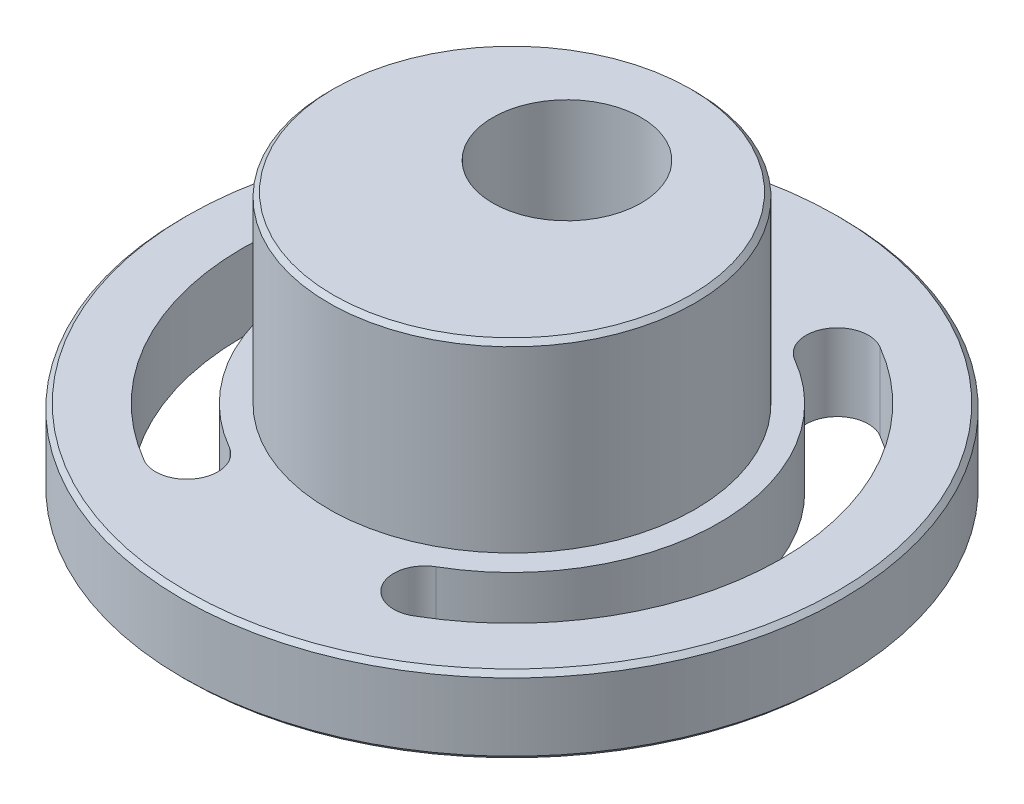
ISO-10303-21;
HEADER;
FILE_DESCRIPTION(('STEP AP214'),'2;1');
FILE_NAME('part.step','',(''),(''),'','','');
FILE_SCHEMA(('AUTOMOTIVE_DESIGN { 1 0 10303 214 1 1 1 1 }'));
ENDSEC;
DATA;
#1=APPLICATION_CONTEXT('core data for automotive mechanical design processes');
#2=APPLICATION_PROTOCOL_DEFINITION('international standard','automotive_design',2000,#1);
#3=PRODUCT_CONTEXT('',#1,'mechanical');
#4=PRODUCT('Part','Part','',(#3));
#5=PRODUCT_RELATED_PRODUCT_CATEGORY('part','',(#4));
#6=PRODUCT_DEFINITION_FORMATION('','',#4);
#7=PRODUCT_DEFINITION_CONTEXT('part definition',#1,'design');
#8=PRODUCT_DEFINITION('design','',#6,#7);
#9=PRODUCT_DEFINITION_SHAPE('','',#8);
#10=(LENGTH_UNIT() NAMED_UNIT(*) SI_UNIT(.MILLI.,.METRE.));
#11=(NAMED_UNIT(*) PLANE_ANGLE_UNIT() SI_UNIT($,.RADIAN.));
#12=(NAMED_UNIT(*) SI_UNIT($,.STERADIAN.) SOLID_ANGLE_UNIT());
#13=UNCERTAINTY_MEASURE_WITH_UNIT(LENGTH_MEASURE(1.E-05),#10,'distance_accuracy_value','');
#14=(GEOMETRIC_REPRESENTATION_CONTEXT(3) GLOBAL_UNCERTAINTY_ASSIGNED_CONTEXT((#13)) GLOBAL_UNIT_ASSIGNED_CONTEXT((#10,
#11,#12)) REPRESENTATION_CONTEXT('',''));
#15=CARTESIAN_POINT('',(0.,0.,0.));
#16=DIRECTION('',(0.,0.,1.));
#17=DIRECTION('',(1.,0.,0.));
#18=AXIS2_PLACEMENT_3D('',#15,#16,#17);
#19=CARTESIAN_POINT('',(240.,-153.95,78.));
#20=DIRECTION('',(0.,1.,0.));
#21=DIRECTION('',(1.,0.,0.));
#22=AXIS2_PLACEMENT_3D('',#19,#20,#21);
#23=CONICAL_SURFACE('',#22,18.,0.785398163397);
#24=CARTESIAN_POINT('',(240.,-154.2,78.));
#25=DIRECTION('',(0.,1.,0.));
#26=DIRECTION('',(1.,0.,0.));
#27=AXIS2_PLACEMENT_3D('',#24,#25,#26);
#28=CIRCLE('',#27,17.75);
#29=CARTESIAN_POINT('',(257.75,-154.2,78.));
#30=VERTEX_POINT('',#29);
#31=EDGE_CURVE('E25',#30,#30,#28,.T.);
#32=ORIENTED_EDGE('',*,*,#31,.T.);
#33=DIRECTION('',(-0.707106781186548,-0.707106781186548,0.));
#34=VECTOR('',#33,1.);
#35=CARTESIAN_POINT('',(258.,-153.95,78.));
#36=LINE('',#35,#34);
#37=CARTESIAN_POINT('',(258.,-153.95,78.));
#38=VERTEX_POINT('',#37);
#39=EDGE_CURVE('E11',#38,#30,#36,.T.);
#40=ORIENTED_EDGE('',*,*,#39,.F.);
#41=CARTESIAN_POINT('',(240.,-153.95,78.));
#42=DIRECTION('',(0.,1.,0.));
#43=DIRECTION('',(1.,0.,0.));
#44=AXIS2_PLACEMENT_3D('',#41,#42,#43);
#45=CIRCLE('',#44,18.);
#46=EDGE_CURVE('E19',#38,#38,#45,.T.);
#47=ORIENTED_EDGE('',*,*,#46,.F.);
#48=ORIENTED_EDGE('',*,*,#39,.T.);
#49=EDGE_LOOP('',(#32,#40,#47,#48));
#50=FACE_BOUND('',#49,.T.);
#51=ADVANCED_FACE('F16',(#50),#23,.T.);
#52=CARTESIAN_POINT('',(240.,-154.2,78.));
#53=DIRECTION('',(0.,-1.,0.));
#54=DIRECTION('',(-1.,0.,0.));
#55=AXIS2_PLACEMENT_3D('',#52,#53,#54);
#56=PLANE('',#55);
#57=CARTESIAN_POINT('',(240.,-154.2,78.));
#58=DIRECTION('',(0.,-1.,0.));
#59=DIRECTION('',(0.50000000000019,0.,0.866025403784329));
#60=AXIS2_PLACEMENT_3D('',#57,#58,#59);
#61=CIRCLE('',#60,11.3);
#62=CARTESIAN_POINT('',(245.65,-154.2,68.213912937236));
#63=VERTEX_POINT('',#62);
#64=CARTESIAN_POINT('',(245.65,-154.2,87.786087062764));
#65=VERTEX_POINT('',#64);
#66=EDGE_CURVE('E207',#63,#65,#61,.T.);
#67=ORIENTED_EDGE('',*,*,#66,.T.);
#68=CARTESIAN_POINT('',(246.5,-154.2,89.258330249198));
#69=DIRECTION('',(0.,1.,0.));
#70=DIRECTION('',(1.,0.,0.));
#71=AXIS2_PLACEMENT_3D('',#68,#69,#70);
#72=CIRCLE('',#71,1.7);
#73=CARTESIAN_POINT('',(247.35,-154.2,90.730573435631));
#74=VERTEX_POINT('',#73);
#75=EDGE_CURVE('E211',#65,#74,#72,.T.);
#76=ORIENTED_EDGE('',*,*,#75,.T.);
#77=CARTESIAN_POINT('',(240.,-154.2,78.));
#78=DIRECTION('',(0.,-1.,0.));
#79=DIRECTION('',(0.50000000000019,0.,-0.866025403784329));
#80=AXIS2_PLACEMENT_3D('',#77,#78,#79);
#81=CIRCLE('',#80,14.7);
#82=CARTESIAN_POINT('',(247.35,-154.2,65.269426564369));
#83=VERTEX_POINT('',#82);
#84=EDGE_CURVE('E176',#83,#74,#81,.T.);
#85=ORIENTED_EDGE('',*,*,#84,.F.);
#86=CARTESIAN_POINT('',(246.5,-154.2,66.741669750802));
#87=DIRECTION('',(0.,1.,0.));
#88=DIRECTION('',(1.,0.,0.));
#89=AXIS2_PLACEMENT_3D('',#86,#87,#88);
#90=CIRCLE('',#89,1.7);
#91=EDGE_CURVE('E147',#83,#63,#90,.T.);
#92=ORIENTED_EDGE('',*,*,#91,.T.);
#93=EDGE_LOOP('',(#67,#76,#85,#92));
#94=FACE_BOUND('',#93,.T.);
#95=CARTESIAN_POINT('',(240.,-154.2,75.));
#96=DIRECTION('',(0.,1.,0.));
#97=DIRECTION('',(1.,0.,0.));
#98=AXIS2_PLACEMENT_3D('',#95,#96,#97);
#99=CIRCLE('',#98,4.05);
#100=CARTESIAN_POINT('',(244.05,-154.2,75.));
#101=VERTEX_POINT('',#100);
#102=EDGE_CURVE('E219',#101,#101,#99,.T.);
#103=ORIENTED_EDGE('',*,*,#102,.T.);
#104=EDGE_LOOP('',(#103));
#105=FACE_BOUND('',#104,.T.);
#106=CARTESIAN_POINT('',(240.,-154.2,78.));
#107=DIRECTION('',(0.,-1.,0.));
#108=DIRECTION('',(-0.50000000000019,0.,-0.866025403784329));
#109=AXIS2_PLACEMENT_3D('',#106,#107,#108);
#110=CIRCLE('',#109,11.3);
#111=CARTESIAN_POINT('',(234.35,-154.2,87.786087062764));
#112=VERTEX_POINT('',#111);
#113=CARTESIAN_POINT('',(234.35,-154.2,68.213912937236));
#114=VERTEX_POINT('',#113);
#115=EDGE_CURVE('E178',#112,#114,#110,.T.);
#116=ORIENTED_EDGE('',*,*,#115,.T.);
#117=CARTESIAN_POINT('',(233.5,-154.2,66.741669750802));
#118=DIRECTION('',(0.,1.,0.));
#119=DIRECTION('',(1.,0.,0.));
#120=AXIS2_PLACEMENT_3D('',#117,#118,#119);
#121=CIRCLE('',#120,1.7);
#122=CARTESIAN_POINT('',(232.65,-154.2,65.269426564369));
#123=VERTEX_POINT('',#122);
#124=EDGE_CURVE('E142',#114,#123,#121,.T.);
#125=ORIENTED_EDGE('',*,*,#124,.T.);
#126=CARTESIAN_POINT('',(240.,-154.2,78.));
#127=DIRECTION('',(0.,-1.,0.));
#128=DIRECTION('',(-0.50000000000019,0.,0.866025403784329));
#129=AXIS2_PLACEMENT_3D('',#126,#127,#128);
#130=CIRCLE('',#129,14.7);
#131=CARTESIAN_POINT('',(232.65,-154.2,90.730573435631));
#132=VERTEX_POINT('',#131);
#133=EDGE_CURVE('E135',#132,#123,#130,.T.);
#134=ORIENTED_EDGE('',*,*,#133,.F.);
#135=CARTESIAN_POINT('',(233.5,-154.2,89.258330249198));
#136=DIRECTION('',(0.,1.,0.));
#137=DIRECTION('',(1.,0.,0.));
#138=AXIS2_PLACEMENT_3D('',#135,#136,#137);
#139=CIRCLE('',#138,1.7);
#140=EDGE_CURVE('E140',#132,#112,#139,.T.);
#141=ORIENTED_EDGE('',*,*,#140,.T.);
#142=EDGE_LOOP('',(#116,#125,#134,#141));
#143=FACE_BOUND('',#142,.T.);
#144=ORIENTED_EDGE('',*,*,#31,.F.);
#145=EDGE_LOOP('',(#144));
#146=FACE_BOUND('',#145,.T.);
#147=ADVANCED_FACE('F138',(#94,#105,#143,#146),#56,.T.);
#148=CARTESIAN_POINT('',(240.,-150.,78.));
#149=DIRECTION('',(0.,-1.,0.));
#150=DIRECTION('',(1.,0.,0.));
#151=AXIS2_PLACEMENT_3D('',#148,#149,#150);
#152=CYLINDRICAL_SURFACE('',#151,18.);
#153=CARTESIAN_POINT('',(240.,-150.25,78.));
#154=DIRECTION('',(0.,1.,0.));
#155=DIRECTION('',(1.,0.,0.));
#156=AXIS2_PLACEMENT_3D('',#153,#154,#155);
#157=CIRCLE('',#156,18.);
#158=CARTESIAN_POINT('',(258.,-150.25,78.));
#159=VERTEX_POINT('',#158);
#160=EDGE_CURVE('E172',#159,#159,#157,.T.);
#161=ORIENTED_EDGE('',*,*,#160,.F.);
#162=DIRECTION('',(0.,-1.,0.));
#163=VECTOR('',#162,1.);
#164=CARTESIAN_POINT('',(258.,-150.,78.));
#165=LINE('',#164,#163);
#166=EDGE_CURVE('E199',#159,#38,#165,.T.);
#167=ORIENTED_EDGE('',*,*,#166,.T.);
#168=ORIENTED_EDGE('',*,*,#46,.T.);
#169=ORIENTED_EDGE('',*,*,#166,.F.);
#170=EDGE_LOOP('',(#161,#167,#168,#169));
#171=FACE_BOUND('',#170,.T.);
#172=ADVANCED_FACE('F262',(#171),#152,.T.);
#173=CARTESIAN_POINT('',(240.,-139.,75.));
#174=DIRECTION('',(0.,-1.,0.));
#175=DIRECTION('',(1.,0.,0.));
#176=AXIS2_PLACEMENT_3D('',#173,#174,#175);
#177=CYLINDRICAL_SURFACE('',#176,4.05);
#178=ORIENTED_EDGE('',*,*,#102,.F.);
#179=DIRECTION('',(0.,-1.,0.));
#180=VECTOR('',#179,1.);
#181=CARTESIAN_POINT('',(244.05,-139.,75.));
#182=LINE('',#181,#180);
#183=CARTESIAN_POINT('',(244.05,-140.,75.));
#184=VERTEX_POINT('',#183);
#185=EDGE_CURVE('E203',#184,#101,#182,.T.);
#186=ORIENTED_EDGE('',*,*,#185,.F.);
#187=CARTESIAN_POINT('',(240.,-140.,75.));
#188=DIRECTION('',(0.,1.,0.));
#189=DIRECTION('',(1.,0.,0.));
#190=AXIS2_PLACEMENT_3D('',#187,#188,#189);
#191=CIRCLE('',#190,4.05);
#192=EDGE_CURVE('E248',#184,#184,#191,.T.);
#193=ORIENTED_EDGE('',*,*,#192,.T.);
#194=ORIENTED_EDGE('',*,*,#185,.T.);
#195=EDGE_LOOP('',(#178,#186,#193,#194));
#196=FACE_BOUND('',#195,.T.);
#197=ADVANCED_FACE('F313',(#196),#177,.F.);
#198=CARTESIAN_POINT('',(240.,-149.,78.));
#199=DIRECTION('',(0.,1.,0.));
#200=DIRECTION('',(0.50000000000019,0.,-0.866025403784329));
#201=AXIS2_PLACEMENT_3D('',#198,#199,#200);
#202=CYLINDRICAL_SURFACE('',#201,14.7);
#203=CARTESIAN_POINT('',(240.,-150.,78.));
#204=DIRECTION('',(0.,-1.,0.));
#205=DIRECTION('',(0.50000000000019,0.,-0.866025403784329));
#206=AXIS2_PLACEMENT_3D('',#203,#204,#205);
#207=CIRCLE('',#206,14.7);
#208=CARTESIAN_POINT('',(247.35,-150.,65.269426564369));
#209=VERTEX_POINT('',#208);
#210=CARTESIAN_POINT('',(247.35,-150.,90.730573435631));
#211=VERTEX_POINT('',#210);
#212=EDGE_CURVE('E244',#209,#211,#207,.T.);
#213=ORIENTED_EDGE('',*,*,#212,.F.);
#214=DIRECTION('',(0.,-1.,0.));
#215=VECTOR('',#214,1.);
#216=CARTESIAN_POINT('',(247.35,-149.,65.269426564369));
#217=LINE('',#216,#215);
#218=EDGE_CURVE('E190',#209,#83,#217,.T.);
#219=ORIENTED_EDGE('',*,*,#218,.T.);
#220=ORIENTED_EDGE('',*,*,#84,.T.);
#221=DIRECTION('',(0.,-1.,0.));
#222=VECTOR('',#221,1.);
#223=CARTESIAN_POINT('',(247.35,-149.,90.730573435631));
#224=LINE('',#223,#222);
#225=EDGE_CURVE('E212',#211,#74,#224,.T.);
#226=ORIENTED_EDGE('',*,*,#225,.F.);
#227=EDGE_LOOP('',(#213,#219,#220,#226));
#228=FACE_BOUND('',#227,.T.);
#229=ADVANCED_FACE('F318',(#228),#202,.F.);
#230=CARTESIAN_POINT('',(246.5,-149.,89.258330249198));
#231=DIRECTION('',(0.,-1.,0.));
#232=DIRECTION('',(1.,0.,0.));
#233=AXIS2_PLACEMENT_3D('',#230,#231,#232);
#234=CYLINDRICAL_SURFACE('',#233,1.7);
#235=ORIENTED_EDGE('',*,*,#75,.F.);
#236=DIRECTION('',(0.,-1.,0.));
#237=VECTOR('',#236,1.);
#238=CARTESIAN_POINT('',(245.65,-149.,87.786087062764));
#239=LINE('',#238,#237);
#240=CARTESIAN_POINT('',(245.65,-150.,87.786087062764));
#241=VERTEX_POINT('',#240);
#242=EDGE_CURVE('E198',#241,#65,#239,.T.);
#243=ORIENTED_EDGE('',*,*,#242,.F.);
#244=CARTESIAN_POINT('',(246.5,-150.,89.258330249198));
#245=DIRECTION('',(0.,1.,0.));
#246=DIRECTION('',(1.,0.,0.));
#247=AXIS2_PLACEMENT_3D('',#244,#245,#246);
#248=CIRCLE('',#247,1.7);
#249=EDGE_CURVE('E228',#241,#211,#248,.T.);
#250=ORIENTED_EDGE('',*,*,#249,.T.);
#251=ORIENTED_EDGE('',*,*,#225,.T.);
#252=EDGE_LOOP('',(#235,#243,#250,#251));
#253=FACE_BOUND('',#252,.T.);
#254=ADVANCED_FACE('F325',(#253),#234,.F.);
#255=CARTESIAN_POINT('',(240.,-149.,78.));
#256=DIRECTION('',(0.,1.,0.));
#257=DIRECTION('',(0.50000000000019,0.,0.866025403784329));
#258=AXIS2_PLACEMENT_3D('',#255,#256,#257);
#259=CYLINDRICAL_SURFACE('',#258,11.3);
#260=CARTESIAN_POINT('',(240.,-150.,78.));
#261=DIRECTION('',(0.,-1.,0.));
#262=DIRECTION('',(0.50000000000019,0.,0.866025403784329));
#263=AXIS2_PLACEMENT_3D('',#260,#261,#262);
#264=CIRCLE('',#263,11.3);
#265=CARTESIAN_POINT('',(245.65,-150.,68.213912937236));
#266=VERTEX_POINT('',#265);
#267=EDGE_CURVE('E252',#266,#241,#264,.T.);
#268=ORIENTED_EDGE('',*,*,#267,.T.);
#269=ORIENTED_EDGE('',*,*,#242,.T.);
#270=ORIENTED_EDGE('',*,*,#66,.F.);
#271=DIRECTION('',(0.,-1.,0.));
#272=VECTOR('',#271,1.);
#273=CARTESIAN_POINT('',(245.65,-149.,68.213912937236));
#274=LINE('',#273,#272);
#275=EDGE_CURVE('E194',#266,#63,#274,.T.);
#276=ORIENTED_EDGE('',*,*,#275,.F.);
#277=EDGE_LOOP('',(#268,#269,#270,#276));
#278=FACE_BOUND('',#277,.T.);
#279=ADVANCED_FACE('F322',(#278),#259,.T.);
#280=CARTESIAN_POINT('',(246.5,-149.,66.741669750802));
#281=DIRECTION('',(0.,-1.,0.));
#282=DIRECTION('',(1.,0.,0.));
#283=AXIS2_PLACEMENT_3D('',#280,#281,#282);
#284=CYLINDRICAL_SURFACE('',#283,1.7);
#285=ORIENTED_EDGE('',*,*,#91,.F.);
#286=ORIENTED_EDGE('',*,*,#218,.F.);
#287=CARTESIAN_POINT('',(246.5,-150.,66.741669750802));
#288=DIRECTION('',(0.,1.,0.));
#289=DIRECTION('',(1.,0.,0.));
#290=AXIS2_PLACEMENT_3D('',#287,#288,#289);
#291=CIRCLE('',#290,1.7);
#292=EDGE_CURVE('E237',#209,#266,#291,.T.);
#293=ORIENTED_EDGE('',*,*,#292,.T.);
#294=ORIENTED_EDGE('',*,*,#275,.T.);
#295=EDGE_LOOP('',(#285,#286,#293,#294));
#296=FACE_BOUND('',#295,.T.);
#297=ADVANCED_FACE('F302',(#296),#284,.F.);
#298=CARTESIAN_POINT('',(240.,-149.,78.));
#299=DIRECTION('',(0.,1.,0.));
#300=DIRECTION('',(-0.50000000000019,0.,0.866025403784329));
#301=AXIS2_PLACEMENT_3D('',#298,#299,#300);
#302=CYLINDRICAL_SURFACE('',#301,14.7);
#303=CARTESIAN_POINT('',(240.,-150.,78.));
#304=DIRECTION('',(0.,-1.,0.));
#305=DIRECTION('',(-0.50000000000019,0.,0.866025403784329));
#306=AXIS2_PLACEMENT_3D('',#303,#304,#305);
#307=CIRCLE('',#306,14.7);
#308=CARTESIAN_POINT('',(232.65,-150.,90.730573435631));
#309=VERTEX_POINT('',#308);
#310=CARTESIAN_POINT('',(232.65,-150.,65.269426564369));
#311=VERTEX_POINT('',#310);
#312=EDGE_CURVE('E160',#309,#311,#307,.T.);
#313=ORIENTED_EDGE('',*,*,#312,.F.);
#314=DIRECTION('',(0.,-1.,0.));
#315=VECTOR('',#314,1.);
#316=CARTESIAN_POINT('',(232.65,-149.,90.730573435631));
#317=LINE('',#316,#315);
#318=EDGE_CURVE('E152',#309,#132,#317,.T.);
#319=ORIENTED_EDGE('',*,*,#318,.T.);
#320=ORIENTED_EDGE('',*,*,#133,.T.);
#321=DIRECTION('',(0.,-1.,0.));
#322=VECTOR('',#321,1.);
#323=CARTESIAN_POINT('',(232.65,-149.,65.269426564369));
#324=LINE('',#323,#322);
#325=EDGE_CURVE('E177',#311,#123,#324,.T.);
#326=ORIENTED_EDGE('',*,*,#325,.F.);
#327=EDGE_LOOP('',(#313,#319,#320,#326));
#328=FACE_BOUND('',#327,.T.);
#329=ADVANCED_FACE('F158',(#328),#302,.F.);
#330=CARTESIAN_POINT('',(233.5,-149.,66.741669750802));
#331=DIRECTION('',(0.,-1.,0.));
#332=DIRECTION('',(1.,0.,0.));
#333=AXIS2_PLACEMENT_3D('',#330,#331,#332);
#334=CYLINDRICAL_SURFACE('',#333,1.7);
#335=ORIENTED_EDGE('',*,*,#325,.T.);
#336=ORIENTED_EDGE('',*,*,#124,.F.);
#337=DIRECTION('',(0.,-1.,0.));
#338=VECTOR('',#337,1.);
#339=CARTESIAN_POINT('',(234.35,-149.,68.213912937236));
#340=LINE('',#339,#338);
#341=CARTESIAN_POINT('',(234.35,-150.,68.213912937236));
#342=VERTEX_POINT('',#341);
#343=EDGE_CURVE('E156',#342,#114,#340,.T.);
#344=ORIENTED_EDGE('',*,*,#343,.F.);
#345=CARTESIAN_POINT('',(233.5,-150.,66.741669750802));
#346=DIRECTION('',(0.,1.,0.));
#347=DIRECTION('',(1.,0.,0.));
#348=AXIS2_PLACEMENT_3D('',#345,#346,#347);
#349=CIRCLE('',#348,1.7);
#350=EDGE_CURVE('E230',#342,#311,#349,.T.);
#351=ORIENTED_EDGE('',*,*,#350,.T.);
#352=EDGE_LOOP('',(#335,#336,#344,#351));
#353=FACE_BOUND('',#352,.T.);
#354=ADVANCED_FACE('F293',(#353),#334,.F.);
#355=CARTESIAN_POINT('',(240.,-149.,78.));
#356=DIRECTION('',(0.,1.,0.));
#357=DIRECTION('',(-0.50000000000019,0.,-0.866025403784329));
#358=AXIS2_PLACEMENT_3D('',#355,#356,#357);
#359=CYLINDRICAL_SURFACE('',#358,11.3);
#360=CARTESIAN_POINT('',(240.,-150.,78.));
#361=DIRECTION('',(0.,-1.,0.));
#362=DIRECTION('',(-0.50000000000019,0.,-0.866025403784329));
#363=AXIS2_PLACEMENT_3D('',#360,#361,#362);
#364=CIRCLE('',#363,11.3);
#365=CARTESIAN_POINT('',(234.35,-150.,87.786087062764));
#366=VERTEX_POINT('',#365);
#367=EDGE_CURVE('E233',#366,#342,#364,.T.);
#368=ORIENTED_EDGE('',*,*,#367,.T.);
#369=ORIENTED_EDGE('',*,*,#343,.T.);
#370=ORIENTED_EDGE('',*,*,#115,.F.);
#371=DIRECTION('',(0.,-1.,0.));
#372=VECTOR('',#371,1.);
#373=CARTESIAN_POINT('',(234.35,-149.,87.786087062764));
#374=LINE('',#373,#372);
#375=EDGE_CURVE('E154',#366,#112,#374,.T.);
#376=ORIENTED_EDGE('',*,*,#375,.F.);
#377=EDGE_LOOP('',(#368,#369,#370,#376));
#378=FACE_BOUND('',#377,.T.);
#379=ADVANCED_FACE('F291',(#378),#359,.T.);
#380=CARTESIAN_POINT('',(233.5,-149.,89.258330249198));
#381=DIRECTION('',(0.,-1.,0.));
#382=DIRECTION('',(1.,0.,0.));
#383=AXIS2_PLACEMENT_3D('',#380,#381,#382);
#384=CYLINDRICAL_SURFACE('',#383,1.7);
#385=ORIENTED_EDGE('',*,*,#318,.F.);
#386=CARTESIAN_POINT('',(233.5,-150.,89.258330249198));
#387=DIRECTION('',(0.,1.,0.));
#388=DIRECTION('',(1.,0.,0.));
#389=AXIS2_PLACEMENT_3D('',#386,#387,#388);
#390=CIRCLE('',#389,1.7);
#391=EDGE_CURVE('E281',#309,#366,#390,.T.);
#392=ORIENTED_EDGE('',*,*,#391,.T.);
#393=ORIENTED_EDGE('',*,*,#375,.T.);
#394=ORIENTED_EDGE('',*,*,#140,.F.);
#395=EDGE_LOOP('',(#385,#392,#393,#394));
#396=FACE_BOUND('',#395,.T.);
#397=ADVANCED_FACE('F150',(#396),#384,.F.);
#398=CARTESIAN_POINT('',(240.,-150.25,78.));
#399=DIRECTION('',(0.,-1.,0.));
#400=DIRECTION('',(1.,0.,0.));
#401=AXIS2_PLACEMENT_3D('',#398,#399,#400);
#402=CONICAL_SURFACE('',#401,18.,0.785398163397);
#403=ORIENTED_EDGE('',*,*,#160,.T.);
#404=DIRECTION('',(0.707106781186548,-0.707106781186548,0.));
#405=VECTOR('',#404,1.);
#406=CARTESIAN_POINT('',(258.,-150.25,78.));
#407=LINE('',#406,#405);
#408=CARTESIAN_POINT('',(257.75,-150.,78.));
#409=VERTEX_POINT('',#408);
#410=EDGE_CURVE('E163',#409,#159,#407,.T.);
#411=ORIENTED_EDGE('',*,*,#410,.F.);
#412=CARTESIAN_POINT('',(240.,-150.,78.));
#413=DIRECTION('',(0.,1.,0.));
#414=DIRECTION('',(1.,0.,0.));
#415=AXIS2_PLACEMENT_3D('',#412,#413,#414);
#416=CIRCLE('',#415,17.75);
#417=EDGE_CURVE('E277',#409,#409,#416,.T.);
#418=ORIENTED_EDGE('',*,*,#417,.F.);
#419=ORIENTED_EDGE('',*,*,#410,.T.);
#420=EDGE_LOOP('',(#403,#411,#418,#419));
#421=FACE_BOUND('',#420,.T.);
#422=ADVANCED_FACE('F258',(#421),#402,.T.);
#423=CARTESIAN_POINT('',(240.,-140.,78.));
#424=DIRECTION('',(0.,-1.,0.));
#425=DIRECTION('',(-1.,0.,0.));
#426=AXIS2_PLACEMENT_3D('',#423,#424,#425);
#427=PLANE('',#426);
#428=ORIENTED_EDGE('',*,*,#192,.F.);
#429=EDGE_LOOP('',(#428));
#430=FACE_BOUND('',#429,.T.);
#431=CARTESIAN_POINT('',(240.,-140.,78.));
#432=DIRECTION('',(0.,1.,0.));
#433=DIRECTION('',(1.,0.,0.));
#434=AXIS2_PLACEMENT_3D('',#431,#432,#433);
#435=CIRCLE('',#434,9.75);
#436=CARTESIAN_POINT('',(249.75,-140.,78.));
#437=VERTEX_POINT('',#436);
#438=EDGE_CURVE('E275',#437,#437,#435,.T.);
#439=ORIENTED_EDGE('',*,*,#438,.T.);
#440=EDGE_LOOP('',(#439));
#441=FACE_BOUND('',#440,.T.);
#442=ADVANCED_FACE('F367',(#430,#441),#427,.F.);
#443=CARTESIAN_POINT('',(240.,-150.,78.));
#444=DIRECTION('',(0.,-1.,0.));
#445=DIRECTION('',(-1.,0.,0.));
#446=AXIS2_PLACEMENT_3D('',#443,#444,#445);
#447=PLANE('',#446);
#448=ORIENTED_EDGE('',*,*,#292,.F.);
#449=ORIENTED_EDGE('',*,*,#212,.T.);
#450=ORIENTED_EDGE('',*,*,#249,.F.);
#451=ORIENTED_EDGE('',*,*,#267,.F.);
#452=EDGE_LOOP('',(#448,#449,#450,#451));
#453=FACE_BOUND('',#452,.T.);
#454=CARTESIAN_POINT('',(240.,-150.,78.));
#455=DIRECTION('',(0.,1.,0.));
#456=DIRECTION('',(1.,0.,0.));
#457=AXIS2_PLACEMENT_3D('',#454,#455,#456);
#458=CIRCLE('',#457,10.);
#459=CARTESIAN_POINT('',(250.,-150.,78.));
#460=VERTEX_POINT('',#459);
#461=EDGE_CURVE('E349',#460,#460,#458,.T.);
#462=ORIENTED_EDGE('',*,*,#461,.F.);
#463=EDGE_LOOP('',(#462));
#464=FACE_BOUND('',#463,.T.);
#465=ORIENTED_EDGE('',*,*,#391,.F.);
#466=ORIENTED_EDGE('',*,*,#312,.T.);
#467=ORIENTED_EDGE('',*,*,#350,.F.);
#468=ORIENTED_EDGE('',*,*,#367,.F.);
#469=EDGE_LOOP('',(#465,#466,#467,#468));
#470=FACE_BOUND('',#469,.T.);
#471=ORIENTED_EDGE('',*,*,#417,.T.);
#472=EDGE_LOOP('',(#471));
#473=FACE_BOUND('',#472,.T.);
#474=ADVANCED_FACE('F287',(#453,#464,#470,#473),#447,.F.);
#475=CARTESIAN_POINT('',(240.,-140.25,78.));
#476=DIRECTION('',(0.,-1.,0.));
#477=DIRECTION('',(1.,0.,0.));
#478=AXIS2_PLACEMENT_3D('',#475,#476,#477);
#479=CONICAL_SURFACE('',#478,10.,0.785398163397);
#480=DIRECTION('',(-0.707106781186548,0.707106781186548,0.));
#481=VECTOR('',#480,1.);
#482=CARTESIAN_POINT('',(250.,-140.25,78.));
#483=LINE('',#482,#481);
#484=CARTESIAN_POINT('',(250.,-140.25,78.));
#485=VERTEX_POINT('',#484);
#486=EDGE_CURVE('E278',#485,#437,#483,.T.);
#487=ORIENTED_EDGE('',*,*,#486,.F.);
#488=CARTESIAN_POINT('',(240.,-140.25,78.));
#489=DIRECTION('',(0.,1.,0.));
#490=DIRECTION('',(1.,0.,0.));
#491=AXIS2_PLACEMENT_3D('',#488,#489,#490);
#492=CIRCLE('',#491,10.);
#493=EDGE_CURVE('E357',#485,#485,#492,.T.);
#494=ORIENTED_EDGE('',*,*,#493,.T.);
#495=ORIENTED_EDGE('',*,*,#486,.T.);
#496=ORIENTED_EDGE('',*,*,#438,.F.);
#497=EDGE_LOOP('',(#487,#494,#495,#496));
#498=FACE_BOUND('',#497,.T.);
#499=ADVANCED_FACE('F366',(#498),#479,.T.);
#500=CARTESIAN_POINT('',(240.,-140.,78.));
#501=DIRECTION('',(0.,-1.,0.));
#502=DIRECTION('',(1.,0.,0.));
#503=AXIS2_PLACEMENT_3D('',#500,#501,#502);
#504=CYLINDRICAL_SURFACE('',#503,10.);
#505=ORIENTED_EDGE('',*,*,#493,.F.);
#506=DIRECTION('',(0.,-1.,0.));
#507=VECTOR('',#506,1.);
#508=CARTESIAN_POINT('',(250.,-140.,78.));
#509=LINE('',#508,#507);
#510=EDGE_CURVE('E352',#485,#460,#509,.T.);
#511=ORIENTED_EDGE('',*,*,#510,.T.);
#512=ORIENTED_EDGE('',*,*,#461,.T.);
#513=ORIENTED_EDGE('',*,*,#510,.F.);
#514=EDGE_LOOP('',(#505,#511,#512,#513));
#515=FACE_BOUND('',#514,.T.);
#516=ADVANCED_FACE('F373',(#515),#504,.T.);
#517=CLOSED_SHELL('',(#51,#147,#172,#197,#229,#254,#279,#297,#329,#354,#379,#397,#422,#442,#474,
#499,#516));
#518=MANIFOLD_SOLID_BREP('B1',#517);
#519=ADVANCED_BREP_SHAPE_REPRESENTATION('',(#18,#518),#14);
#520=SHAPE_DEFINITION_REPRESENTATION(#9,#519);
ENDSEC;
END-ISO-10303-21;
